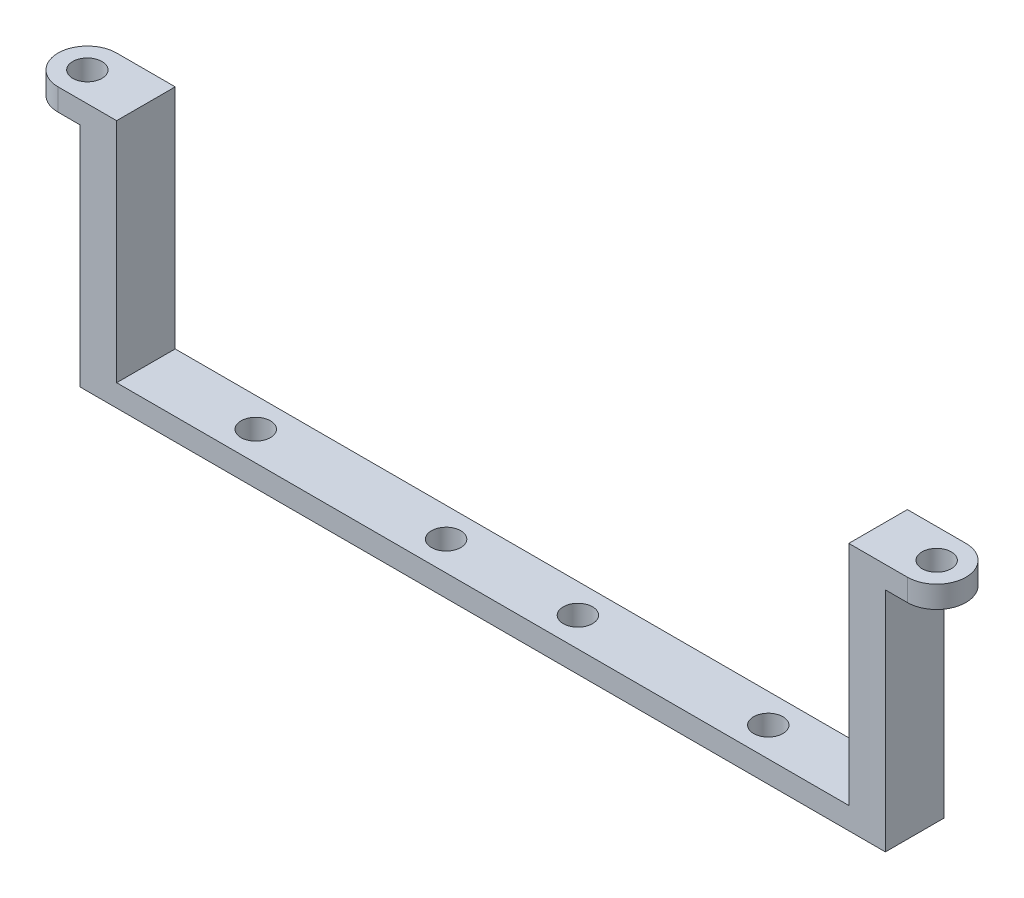
ISO-10303-21;
HEADER;
FILE_DESCRIPTION(('STEP AP214'),'2;1');
FILE_NAME('part.step','',(''),(''),'','','');
FILE_SCHEMA(('AUTOMOTIVE_DESIGN { 1 0 10303 214 1 1 1 1 }'));
ENDSEC;
DATA;
#1=APPLICATION_CONTEXT('core data for automotive mechanical design processes');
#2=APPLICATION_PROTOCOL_DEFINITION('international standard','automotive_design',2000,#1);
#3=PRODUCT_CONTEXT('',#1,'mechanical');
#4=PRODUCT('Part','Part','',(#3));
#5=PRODUCT_RELATED_PRODUCT_CATEGORY('part','',(#4));
#6=PRODUCT_DEFINITION_FORMATION('','',#4);
#7=PRODUCT_DEFINITION_CONTEXT('part definition',#1,'design');
#8=PRODUCT_DEFINITION('design','',#6,#7);
#9=PRODUCT_DEFINITION_SHAPE('','',#8);
#10=(LENGTH_UNIT() NAMED_UNIT(*) SI_UNIT(.MILLI.,.METRE.));
#11=(NAMED_UNIT(*) PLANE_ANGLE_UNIT() SI_UNIT($,.RADIAN.));
#12=(NAMED_UNIT(*) SI_UNIT($,.STERADIAN.) SOLID_ANGLE_UNIT());
#13=UNCERTAINTY_MEASURE_WITH_UNIT(LENGTH_MEASURE(1.E-05),#10,'distance_accuracy_value','');
#14=(GEOMETRIC_REPRESENTATION_CONTEXT(3) GLOBAL_UNCERTAINTY_ASSIGNED_CONTEXT((#13)) GLOBAL_UNIT_ASSIGNED_CONTEXT((#10,
#11,#12)) REPRESENTATION_CONTEXT('',''));
#15=CARTESIAN_POINT('',(0.,0.,0.));
#16=DIRECTION('',(0.,0.,1.));
#17=DIRECTION('',(1.,0.,0.));
#18=AXIS2_PLACEMENT_3D('',#15,#16,#17);
#19=CARTESIAN_POINT('',(0.,3.,0.));
#20=DIRECTION('',(0.,-1.,0.));
#21=DIRECTION('',(0.,0.,-1.));
#22=AXIS2_PLACEMENT_3D('',#19,#20,#21);
#23=PLANE('',#22);
#24=CARTESIAN_POINT('',(-35.,3.,0.));
#25=DIRECTION('',(0.,1.,0.));
#26=DIRECTION('',(0.,0.,1.));
#27=AXIS2_PLACEMENT_3D('',#24,#25,#26);
#28=CIRCLE('',#27,2.);
#29=CARTESIAN_POINT('',(-35.,3.,2.));
#30=VERTEX_POINT('',#29);
#31=EDGE_CURVE('E240',#30,#30,#28,.T.);
#32=ORIENTED_EDGE('',*,*,#31,.F.);
#33=EDGE_LOOP('',(#32));
#34=FACE_BOUND('',#33,.T.);
#35=CARTESIAN_POINT('',(35.,3.,0.));
#36=DIRECTION('',(0.,1.,0.));
#37=DIRECTION('',(0.,0.,1.));
#38=AXIS2_PLACEMENT_3D('',#35,#36,#37);
#39=CIRCLE('',#38,2.);
#40=CARTESIAN_POINT('',(35.,3.,2.));
#41=VERTEX_POINT('',#40);
#42=EDGE_CURVE('E234',#41,#41,#39,.T.);
#43=ORIENTED_EDGE('',*,*,#42,.F.);
#44=EDGE_LOOP('',(#43));
#45=FACE_BOUND('',#44,.T.);
#46=CARTESIAN_POINT('',(-8.99999999999999,3.,0.));
#47=DIRECTION('',(0.,1.,0.));
#48=DIRECTION('',(0.,0.,1.));
#49=AXIS2_PLACEMENT_3D('',#46,#47,#48);
#50=CIRCLE('',#49,2.);
#51=CARTESIAN_POINT('',(-8.99999999999999,3.,2.));
#52=VERTEX_POINT('',#51);
#53=EDGE_CURVE('E228',#52,#52,#50,.T.);
#54=ORIENTED_EDGE('',*,*,#53,.F.);
#55=EDGE_LOOP('',(#54));
#56=FACE_BOUND('',#55,.T.);
#57=CARTESIAN_POINT('',(9.00000000000001,3.,0.));
#58=DIRECTION('',(0.,1.,0.));
#59=DIRECTION('',(0.,0.,1.));
#60=AXIS2_PLACEMENT_3D('',#57,#58,#59);
#61=CIRCLE('',#60,2.);
#62=CARTESIAN_POINT('',(9.00000000000001,3.,2.));
#63=VERTEX_POINT('',#62);
#64=EDGE_CURVE('E222',#63,#63,#61,.T.);
#65=ORIENTED_EDGE('',*,*,#64,.F.);
#66=EDGE_LOOP('',(#65));
#67=FACE_BOUND('',#66,.T.);
#68=DIRECTION('',(0.,0.,1.));
#69=VECTOR('',#68,1.);
#70=CARTESIAN_POINT('',(50.,3.,-4.00000000000001));
#71=LINE('',#70,#69);
#72=CARTESIAN_POINT('',(50.,3.,-4.00000000000001));
#73=VERTEX_POINT('',#72);
#74=CARTESIAN_POINT('',(50.,3.,4.));
#75=VERTEX_POINT('',#74);
#76=EDGE_CURVE('E207',#73,#75,#71,.T.);
#77=ORIENTED_EDGE('',*,*,#76,.F.);
#78=DIRECTION('',(-1.,0.,0.));
#79=VECTOR('',#78,1.);
#80=CARTESIAN_POINT('',(55.,3.,-4.00000000000001));
#81=LINE('',#80,#79);
#82=CARTESIAN_POINT('',(-50.,3.,-4.00000000000001));
#83=VERTEX_POINT('',#82);
#84=EDGE_CURVE('E247',#73,#83,#81,.T.);
#85=ORIENTED_EDGE('',*,*,#84,.T.);
#86=DIRECTION('',(0.,0.,-1.));
#87=VECTOR('',#86,1.);
#88=CARTESIAN_POINT('',(-50.,3.,-4.00000000000001));
#89=LINE('',#88,#87);
#90=CARTESIAN_POINT('',(-50.,3.,4.00000000000001));
#91=VERTEX_POINT('',#90);
#92=EDGE_CURVE('E61',#91,#83,#89,.T.);
#93=ORIENTED_EDGE('',*,*,#92,.F.);
#94=DIRECTION('',(1.,0.,0.));
#95=VECTOR('',#94,1.);
#96=CARTESIAN_POINT('',(55.,3.,3.99999999999999));
#97=LINE('',#96,#95);
#98=EDGE_CURVE('E56',#91,#75,#97,.T.);
#99=ORIENTED_EDGE('',*,*,#98,.T.);
#100=EDGE_LOOP('',(#77,#85,#93,#99));
#101=FACE_BOUND('',#100,.T.);
#102=ADVANCED_FACE('F41',(#34,#45,#56,#67,#101),#23,.F.);
#103=CARTESIAN_POINT('',(0.,0.,0.));
#104=DIRECTION('',(0.,-1.,0.));
#105=DIRECTION('',(0.,0.,-1.));
#106=AXIS2_PLACEMENT_3D('',#103,#104,#105);
#107=PLANE('',#106);
#108=CARTESIAN_POINT('',(-8.99999999999999,0.,0.));
#109=DIRECTION('',(0.,1.,0.));
#110=DIRECTION('',(0.,0.,1.));
#111=AXIS2_PLACEMENT_3D('',#108,#109,#110);
#112=CIRCLE('',#111,2.);
#113=CARTESIAN_POINT('',(-8.99999999999999,0.,2.));
#114=VERTEX_POINT('',#113);
#115=EDGE_CURVE('E225',#114,#114,#112,.T.);
#116=ORIENTED_EDGE('',*,*,#115,.T.);
#117=EDGE_LOOP('',(#116));
#118=FACE_BOUND('',#117,.T.);
#119=CARTESIAN_POINT('',(-35.,0.,0.));
#120=DIRECTION('',(0.,1.,0.));
#121=DIRECTION('',(0.,0.,1.));
#122=AXIS2_PLACEMENT_3D('',#119,#120,#121);
#123=CIRCLE('',#122,2.);
#124=CARTESIAN_POINT('',(-35.,0.,2.));
#125=VERTEX_POINT('',#124);
#126=EDGE_CURVE('E237',#125,#125,#123,.T.);
#127=ORIENTED_EDGE('',*,*,#126,.T.);
#128=EDGE_LOOP('',(#127));
#129=FACE_BOUND('',#128,.T.);
#130=DIRECTION('',(0.,0.,1.));
#131=VECTOR('',#130,1.);
#132=CARTESIAN_POINT('',(-55.,0.,-3.99999999999999));
#133=LINE('',#132,#131);
#134=CARTESIAN_POINT('',(-55.,0.,-3.99999999999999));
#135=VERTEX_POINT('',#134);
#136=CARTESIAN_POINT('',(-55.,0.,4.00000000000001));
#137=VERTEX_POINT('',#136);
#138=EDGE_CURVE('E243',#135,#137,#133,.T.);
#139=ORIENTED_EDGE('',*,*,#138,.F.);
#140=DIRECTION('',(-1.,0.,0.));
#141=VECTOR('',#140,1.);
#142=CARTESIAN_POINT('',(55.,0.,-4.00000000000001));
#143=LINE('',#142,#141);
#144=CARTESIAN_POINT('',(55.,0.,-4.00000000000001));
#145=VERTEX_POINT('',#144);
#146=EDGE_CURVE('E248',#145,#135,#143,.T.);
#147=ORIENTED_EDGE('',*,*,#146,.F.);
#148=DIRECTION('',(0.,0.,-1.));
#149=VECTOR('',#148,1.);
#150=CARTESIAN_POINT('',(55.,0.,-4.00000000000001));
#151=LINE('',#150,#149);
#152=CARTESIAN_POINT('',(55.,0.,3.99999999999999));
#153=VERTEX_POINT('',#152);
#154=EDGE_CURVE('E255',#153,#145,#151,.T.);
#155=ORIENTED_EDGE('',*,*,#154,.F.);
#156=DIRECTION('',(1.,0.,0.));
#157=VECTOR('',#156,1.);
#158=CARTESIAN_POINT('',(55.,0.,3.99999999999999));
#159=LINE('',#158,#157);
#160=EDGE_CURVE('E253',#137,#153,#159,.T.);
#161=ORIENTED_EDGE('',*,*,#160,.F.);
#162=EDGE_LOOP('',(#139,#147,#155,#161));
#163=FACE_BOUND('',#162,.T.);
#164=CARTESIAN_POINT('',(35.,0.,0.));
#165=DIRECTION('',(0.,1.,0.));
#166=DIRECTION('',(0.,0.,1.));
#167=AXIS2_PLACEMENT_3D('',#164,#165,#166);
#168=CIRCLE('',#167,2.);
#169=CARTESIAN_POINT('',(35.,0.,2.));
#170=VERTEX_POINT('',#169);
#171=EDGE_CURVE('E231',#170,#170,#168,.T.);
#172=ORIENTED_EDGE('',*,*,#171,.T.);
#173=EDGE_LOOP('',(#172));
#174=FACE_BOUND('',#173,.T.);
#175=CARTESIAN_POINT('',(9.00000000000001,0.,0.));
#176=DIRECTION('',(0.,1.,0.));
#177=DIRECTION('',(0.,0.,1.));
#178=AXIS2_PLACEMENT_3D('',#175,#176,#177);
#179=CIRCLE('',#178,2.);
#180=CARTESIAN_POINT('',(9.00000000000001,0.,2.));
#181=VERTEX_POINT('',#180);
#182=EDGE_CURVE('E221',#181,#181,#179,.T.);
#183=ORIENTED_EDGE('',*,*,#182,.T.);
#184=EDGE_LOOP('',(#183));
#185=FACE_BOUND('',#184,.T.);
#186=ADVANCED_FACE('F269',(#118,#129,#163,#174,#185),#107,.T.);
#187=CARTESIAN_POINT('',(-55.,3.,-3.99999999999999));
#188=DIRECTION('',(1.,0.,0.));
#189=DIRECTION('',(0.,0.,-1.));
#190=AXIS2_PLACEMENT_3D('',#187,#188,#189);
#191=PLANE('',#190);
#192=ORIENTED_EDGE('',*,*,#138,.T.);
#193=DIRECTION('',(0.,-1.,0.));
#194=VECTOR('',#193,1.);
#195=CARTESIAN_POINT('',(-55.,3.,4.00000000000001));
#196=LINE('',#195,#194);
#197=CARTESIAN_POINT('',(-55.,31.,4.00000000000001));
#198=VERTEX_POINT('',#197);
#199=EDGE_CURVE('E11',#198,#137,#196,.T.);
#200=ORIENTED_EDGE('',*,*,#199,.F.);
#201=DIRECTION('',(0.,0.,1.));
#202=VECTOR('',#201,1.);
#203=CARTESIAN_POINT('',(-55.,31.,-3.99999999999999));
#204=LINE('',#203,#202);
#205=CARTESIAN_POINT('',(-55.,31.,-3.99999999999999));
#206=VERTEX_POINT('',#205);
#207=EDGE_CURVE('E211',#206,#198,#204,.T.);
#208=ORIENTED_EDGE('',*,*,#207,.F.);
#209=DIRECTION('',(0.,-1.,0.));
#210=VECTOR('',#209,1.);
#211=CARTESIAN_POINT('',(-55.,3.,-3.99999999999999));
#212=LINE('',#211,#210);
#213=EDGE_CURVE('E250',#206,#135,#212,.T.);
#214=ORIENTED_EDGE('',*,*,#213,.T.);
#215=EDGE_LOOP('',(#192,#200,#208,#214));
#216=FACE_BOUND('',#215,.T.);
#217=ADVANCED_FACE('F43',(#216),#191,.F.);
#218=CARTESIAN_POINT('',(55.,3.,3.99999999999999));
#219=DIRECTION('',(0.,0.,-1.));
#220=DIRECTION('',(-1.,0.,0.));
#221=AXIS2_PLACEMENT_3D('',#218,#219,#220);
#222=PLANE('',#221);
#223=ORIENTED_EDGE('',*,*,#160,.T.);
#224=DIRECTION('',(0.,-1.,0.));
#225=VECTOR('',#224,1.);
#226=CARTESIAN_POINT('',(55.,3.,3.99999999999999));
#227=LINE('',#226,#225);
#228=CARTESIAN_POINT('',(55.,31.,3.99999999999999));
#229=VERTEX_POINT('',#228);
#230=EDGE_CURVE('E49',#229,#153,#227,.T.);
#231=ORIENTED_EDGE('',*,*,#230,.F.);
#232=DIRECTION('',(1.,0.,0.));
#233=VECTOR('',#232,1.);
#234=CARTESIAN_POINT('',(50.,31.,4.00000000000001));
#235=LINE('',#234,#233);
#236=CARTESIAN_POINT('',(58.,31.,4.00000000000005));
#237=VERTEX_POINT('',#236);
#238=EDGE_CURVE('E141',#229,#237,#235,.T.);
#239=ORIENTED_EDGE('',*,*,#238,.T.);
#240=DIRECTION('',(0.,-1.,0.));
#241=VECTOR('',#240,1.);
#242=CARTESIAN_POINT('',(58.,34.,4.00000000000005));
#243=LINE('',#242,#241);
#244=CARTESIAN_POINT('',(58.,34.,4.00000000000005));
#245=VERTEX_POINT('',#244);
#246=EDGE_CURVE('E137',#245,#237,#243,.T.);
#247=ORIENTED_EDGE('',*,*,#246,.F.);
#248=DIRECTION('',(1.,0.,0.));
#249=VECTOR('',#248,1.);
#250=CARTESIAN_POINT('',(50.,34.,4.00000000000001));
#251=LINE('',#250,#249);
#252=CARTESIAN_POINT('',(50.,34.,4.00000000000001));
#253=VERTEX_POINT('',#252);
#254=EDGE_CURVE('E158',#253,#245,#251,.T.);
#255=ORIENTED_EDGE('',*,*,#254,.F.);
#256=DIRECTION('',(0.,-1.,0.));
#257=VECTOR('',#256,1.);
#258=CARTESIAN_POINT('',(50.,31.,4.00000000000001));
#259=LINE('',#258,#257);
#260=EDGE_CURVE('E202',#253,#75,#259,.T.);
#261=ORIENTED_EDGE('',*,*,#260,.T.);
#262=ORIENTED_EDGE('',*,*,#98,.F.);
#263=DIRECTION('',(0.,-1.,0.));
#264=VECTOR('',#263,1.);
#265=CARTESIAN_POINT('',(-50.,31.,4.00000000000001));
#266=LINE('',#265,#264);
#267=CARTESIAN_POINT('',(-50.,34.,4.00000000000001));
#268=VERTEX_POINT('',#267);
#269=EDGE_CURVE('E218',#268,#91,#266,.T.);
#270=ORIENTED_EDGE('',*,*,#269,.F.);
#271=DIRECTION('',(1.,0.,0.));
#272=VECTOR('',#271,1.);
#273=CARTESIAN_POINT('',(-50.,34.,4.00000000000001));
#274=LINE('',#273,#272);
#275=CARTESIAN_POINT('',(-58.,34.,4.00000000000001));
#276=VERTEX_POINT('',#275);
#277=EDGE_CURVE('E188',#276,#268,#274,.T.);
#278=ORIENTED_EDGE('',*,*,#277,.F.);
#279=DIRECTION('',(0.,-1.,0.));
#280=VECTOR('',#279,1.);
#281=CARTESIAN_POINT('',(-58.,34.,4.00000000000001));
#282=LINE('',#281,#280);
#283=CARTESIAN_POINT('',(-58.,31.,4.00000000000001));
#284=VERTEX_POINT('',#283);
#285=EDGE_CURVE('E191',#276,#284,#282,.T.);
#286=ORIENTED_EDGE('',*,*,#285,.T.);
#287=DIRECTION('',(1.,0.,0.));
#288=VECTOR('',#287,1.);
#289=CARTESIAN_POINT('',(-50.,31.,4.00000000000001));
#290=LINE('',#289,#288);
#291=EDGE_CURVE('E184',#284,#198,#290,.T.);
#292=ORIENTED_EDGE('',*,*,#291,.T.);
#293=ORIENTED_EDGE('',*,*,#199,.T.);
#294=EDGE_LOOP('',(#223,#231,#239,#247,#255,#261,#262,#270,#278,#286,#292,#293));
#295=FACE_BOUND('',#294,.T.);
#296=ADVANCED_FACE('F291',(#295),#222,.F.);
#297=CARTESIAN_POINT('',(55.,3.,-4.00000000000001));
#298=DIRECTION('',(-1.,0.,0.));
#299=DIRECTION('',(0.,0.,1.));
#300=AXIS2_PLACEMENT_3D('',#297,#298,#299);
#301=PLANE('',#300);
#302=ORIENTED_EDGE('',*,*,#154,.T.);
#303=DIRECTION('',(0.,-1.,0.));
#304=VECTOR('',#303,1.);
#305=CARTESIAN_POINT('',(55.,3.,-4.00000000000001));
#306=LINE('',#305,#304);
#307=CARTESIAN_POINT('',(55.,31.,-4.00000000000001));
#308=VERTEX_POINT('',#307);
#309=EDGE_CURVE('E260',#308,#145,#306,.T.);
#310=ORIENTED_EDGE('',*,*,#309,.F.);
#311=DIRECTION('',(0.,0.,-1.));
#312=VECTOR('',#311,1.);
#313=CARTESIAN_POINT('',(55.,31.,-4.00000000000001));
#314=LINE('',#313,#312);
#315=EDGE_CURVE('E154',#229,#308,#314,.T.);
#316=ORIENTED_EDGE('',*,*,#315,.F.);
#317=ORIENTED_EDGE('',*,*,#230,.T.);
#318=EDGE_LOOP('',(#302,#310,#316,#317));
#319=FACE_BOUND('',#318,.T.);
#320=ADVANCED_FACE('F264',(#319),#301,.F.);
#321=CARTESIAN_POINT('',(55.,3.,-4.00000000000001));
#322=DIRECTION('',(0.,0.,1.));
#323=DIRECTION('',(1.,0.,0.));
#324=AXIS2_PLACEMENT_3D('',#321,#322,#323);
#325=PLANE('',#324);
#326=ORIENTED_EDGE('',*,*,#146,.T.);
#327=ORIENTED_EDGE('',*,*,#213,.F.);
#328=DIRECTION('',(-1.,0.,0.));
#329=VECTOR('',#328,1.);
#330=CARTESIAN_POINT('',(-50.,31.,-4.00000000000001));
#331=LINE('',#330,#329);
#332=CARTESIAN_POINT('',(-58.,31.,-4.));
#333=VERTEX_POINT('',#332);
#334=EDGE_CURVE('E177',#206,#333,#331,.T.);
#335=ORIENTED_EDGE('',*,*,#334,.T.);
#336=DIRECTION('',(0.,-1.,0.));
#337=VECTOR('',#336,1.);
#338=CARTESIAN_POINT('',(-58.,34.,-4.));
#339=LINE('',#338,#337);
#340=CARTESIAN_POINT('',(-58.,34.,-4.));
#341=VERTEX_POINT('',#340);
#342=EDGE_CURVE('E199',#341,#333,#339,.T.);
#343=ORIENTED_EDGE('',*,*,#342,.F.);
#344=DIRECTION('',(-1.,0.,0.));
#345=VECTOR('',#344,1.);
#346=CARTESIAN_POINT('',(-50.,34.,-4.00000000000001));
#347=LINE('',#346,#345);
#348=CARTESIAN_POINT('',(-50.,34.,-4.00000000000001));
#349=VERTEX_POINT('',#348);
#350=EDGE_CURVE('E183',#349,#341,#347,.T.);
#351=ORIENTED_EDGE('',*,*,#350,.F.);
#352=DIRECTION('',(0.,-1.,0.));
#353=VECTOR('',#352,1.);
#354=CARTESIAN_POINT('',(-50.,31.,-4.00000000000001));
#355=LINE('',#354,#353);
#356=EDGE_CURVE('E214',#349,#83,#355,.T.);
#357=ORIENTED_EDGE('',*,*,#356,.T.);
#358=ORIENTED_EDGE('',*,*,#84,.F.);
#359=DIRECTION('',(0.,-1.,0.));
#360=VECTOR('',#359,1.);
#361=CARTESIAN_POINT('',(50.,31.,-4.00000000000001));
#362=LINE('',#361,#360);
#363=CARTESIAN_POINT('',(50.,34.,-4.00000000000001));
#364=VERTEX_POINT('',#363);
#365=EDGE_CURVE('E204',#364,#73,#362,.T.);
#366=ORIENTED_EDGE('',*,*,#365,.F.);
#367=DIRECTION('',(-1.,0.,0.));
#368=VECTOR('',#367,1.);
#369=CARTESIAN_POINT('',(50.,34.,-4.00000000000001));
#370=LINE('',#369,#368);
#371=CARTESIAN_POINT('',(58.,34.,-4.00000000000008));
#372=VERTEX_POINT('',#371);
#373=EDGE_CURVE('E149',#372,#364,#370,.T.);
#374=ORIENTED_EDGE('',*,*,#373,.F.);
#375=DIRECTION('',(0.,-1.,0.));
#376=VECTOR('',#375,1.);
#377=CARTESIAN_POINT('',(58.,34.,-4.00000000000008));
#378=LINE('',#377,#376);
#379=CARTESIAN_POINT('',(58.,31.,-4.00000000000008));
#380=VERTEX_POINT('',#379);
#381=EDGE_CURVE('E134',#372,#380,#378,.T.);
#382=ORIENTED_EDGE('',*,*,#381,.T.);
#383=DIRECTION('',(-1.,0.,0.));
#384=VECTOR('',#383,1.);
#385=CARTESIAN_POINT('',(50.,31.,-4.00000000000001));
#386=LINE('',#385,#384);
#387=EDGE_CURVE('E142',#380,#308,#386,.T.);
#388=ORIENTED_EDGE('',*,*,#387,.T.);
#389=ORIENTED_EDGE('',*,*,#309,.T.);
#390=EDGE_LOOP('',(#326,#327,#335,#343,#351,#357,#358,#366,#374,#382,#388,#389));
#391=FACE_BOUND('',#390,.T.);
#392=ADVANCED_FACE('F146',(#391),#325,.F.);
#393=CARTESIAN_POINT('',(-35.,3.,0.));
#394=DIRECTION('',(0.,-1.,0.));
#395=DIRECTION('',(0.,0.,-1.));
#396=AXIS2_PLACEMENT_3D('',#393,#394,#395);
#397=CYLINDRICAL_SURFACE('',#396,2.);
#398=ORIENTED_EDGE('',*,*,#31,.T.);
#399=EDGE_LOOP('',(#398));
#400=FACE_BOUND('',#399,.T.);
#401=ORIENTED_EDGE('',*,*,#126,.F.);
#402=EDGE_LOOP('',(#401));
#403=FACE_BOUND('',#402,.T.);
#404=ADVANCED_FACE('F307',(#400,#403),#397,.F.);
#405=CARTESIAN_POINT('',(35.,3.,0.));
#406=DIRECTION('',(0.,-1.,0.));
#407=DIRECTION('',(0.,0.,-1.));
#408=AXIS2_PLACEMENT_3D('',#405,#406,#407);
#409=CYLINDRICAL_SURFACE('',#408,2.);
#410=ORIENTED_EDGE('',*,*,#42,.T.);
#411=EDGE_LOOP('',(#410));
#412=FACE_BOUND('',#411,.T.);
#413=ORIENTED_EDGE('',*,*,#171,.F.);
#414=EDGE_LOOP('',(#413));
#415=FACE_BOUND('',#414,.T.);
#416=ADVANCED_FACE('F334',(#412,#415),#409,.F.);
#417=CARTESIAN_POINT('',(-8.99999999999999,3.,0.));
#418=DIRECTION('',(0.,-1.,0.));
#419=DIRECTION('',(0.,0.,-1.));
#420=AXIS2_PLACEMENT_3D('',#417,#418,#419);
#421=CYLINDRICAL_SURFACE('',#420,2.);
#422=ORIENTED_EDGE('',*,*,#53,.T.);
#423=EDGE_LOOP('',(#422));
#424=FACE_BOUND('',#423,.T.);
#425=ORIENTED_EDGE('',*,*,#115,.F.);
#426=EDGE_LOOP('',(#425));
#427=FACE_BOUND('',#426,.T.);
#428=ADVANCED_FACE('F345',(#424,#427),#421,.F.);
#429=CARTESIAN_POINT('',(9.00000000000001,3.,0.));
#430=DIRECTION('',(0.,-1.,0.));
#431=DIRECTION('',(0.,0.,-1.));
#432=AXIS2_PLACEMENT_3D('',#429,#430,#431);
#433=CYLINDRICAL_SURFACE('',#432,2.);
#434=ORIENTED_EDGE('',*,*,#64,.T.);
#435=EDGE_LOOP('',(#434));
#436=FACE_BOUND('',#435,.T.);
#437=ORIENTED_EDGE('',*,*,#182,.F.);
#438=EDGE_LOOP('',(#437));
#439=FACE_BOUND('',#438,.T.);
#440=ADVANCED_FACE('F355',(#436,#439),#433,.F.);
#441=CARTESIAN_POINT('',(-50.,31.,-4.00000000000001));
#442=DIRECTION('',(-1.,0.,0.));
#443=DIRECTION('',(0.,0.,1.));
#444=AXIS2_PLACEMENT_3D('',#441,#442,#443);
#445=PLANE('',#444);
#446=ORIENTED_EDGE('',*,*,#92,.T.);
#447=ORIENTED_EDGE('',*,*,#356,.F.);
#448=DIRECTION('',(0.,0.,-1.));
#449=VECTOR('',#448,1.);
#450=CARTESIAN_POINT('',(-50.,34.,-4.00000000000001));
#451=LINE('',#450,#449);
#452=EDGE_CURVE('E180',#268,#349,#451,.T.);
#453=ORIENTED_EDGE('',*,*,#452,.F.);
#454=ORIENTED_EDGE('',*,*,#269,.T.);
#455=EDGE_LOOP('',(#446,#447,#453,#454));
#456=FACE_BOUND('',#455,.T.);
#457=ADVANCED_FACE('F290',(#456),#445,.F.);
#458=CARTESIAN_POINT('',(50.,31.,-4.00000000000001));
#459=DIRECTION('',(1.,0.,0.));
#460=DIRECTION('',(0.,0.,-1.));
#461=AXIS2_PLACEMENT_3D('',#458,#459,#460);
#462=PLANE('',#461);
#463=ORIENTED_EDGE('',*,*,#76,.T.);
#464=ORIENTED_EDGE('',*,*,#260,.F.);
#465=DIRECTION('',(0.,0.,1.));
#466=VECTOR('',#465,1.);
#467=CARTESIAN_POINT('',(50.,34.,-4.00000000000001));
#468=LINE('',#467,#466);
#469=EDGE_CURVE('E155',#364,#253,#468,.T.);
#470=ORIENTED_EDGE('',*,*,#469,.F.);
#471=ORIENTED_EDGE('',*,*,#365,.T.);
#472=EDGE_LOOP('',(#463,#464,#470,#471));
#473=FACE_BOUND('',#472,.T.);
#474=ADVANCED_FACE('F295',(#473),#462,.F.);
#475=CARTESIAN_POINT('',(-58.,31.,0.));
#476=DIRECTION('',(0.,1.,0.));
#477=DIRECTION('',(0.,0.,1.));
#478=AXIS2_PLACEMENT_3D('',#475,#476,#477);
#479=PLANE('',#478);
#480=CARTESIAN_POINT('',(-58.,31.,0.));
#481=DIRECTION('',(0.,1.,0.));
#482=DIRECTION('',(0.,0.,1.));
#483=AXIS2_PLACEMENT_3D('',#480,#481,#482);
#484=CIRCLE('',#483,2.);
#485=CARTESIAN_POINT('',(-58.,31.,2.00000000000001));
#486=VERTEX_POINT('',#485);
#487=EDGE_CURVE('E171',#486,#486,#484,.T.);
#488=ORIENTED_EDGE('',*,*,#487,.T.);
#489=EDGE_LOOP('',(#488));
#490=FACE_BOUND('',#489,.T.);
#491=ORIENTED_EDGE('',*,*,#334,.F.);
#492=ORIENTED_EDGE('',*,*,#207,.T.);
#493=ORIENTED_EDGE('',*,*,#291,.F.);
#494=CARTESIAN_POINT('',(-58.,31.,0.));
#495=DIRECTION('',(0.,1.,0.));
#496=DIRECTION('',(0.,0.,1.));
#497=AXIS2_PLACEMENT_3D('',#494,#495,#496);
#498=CIRCLE('',#497,4.00000000000001);
#499=EDGE_CURVE('E193',#333,#284,#498,.T.);
#500=ORIENTED_EDGE('',*,*,#499,.F.);
#501=EDGE_LOOP('',(#491,#492,#493,#500));
#502=FACE_BOUND('',#501,.T.);
#503=ADVANCED_FACE('F277',(#490,#502),#479,.F.);
#504=CARTESIAN_POINT('',(-58.,34.,0.));
#505=DIRECTION('',(0.,1.,0.));
#506=DIRECTION('',(0.,0.,1.));
#507=AXIS2_PLACEMENT_3D('',#504,#505,#506);
#508=PLANE('',#507);
#509=ORIENTED_EDGE('',*,*,#452,.T.);
#510=ORIENTED_EDGE('',*,*,#350,.T.);
#511=CARTESIAN_POINT('',(-58.,34.,0.));
#512=DIRECTION('',(0.,1.,0.));
#513=DIRECTION('',(0.,0.,1.));
#514=AXIS2_PLACEMENT_3D('',#511,#512,#513);
#515=CIRCLE('',#514,4.00000000000001);
#516=EDGE_CURVE('E186',#341,#276,#515,.T.);
#517=ORIENTED_EDGE('',*,*,#516,.T.);
#518=ORIENTED_EDGE('',*,*,#277,.T.);
#519=EDGE_LOOP('',(#509,#510,#517,#518));
#520=FACE_BOUND('',#519,.T.);
#521=CARTESIAN_POINT('',(-58.,34.,0.));
#522=DIRECTION('',(0.,1.,0.));
#523=DIRECTION('',(0.,0.,1.));
#524=AXIS2_PLACEMENT_3D('',#521,#522,#523);
#525=CIRCLE('',#524,2.);
#526=CARTESIAN_POINT('',(-58.,34.,2.00000000000001));
#527=VERTEX_POINT('',#526);
#528=EDGE_CURVE('E174',#527,#527,#525,.T.);
#529=ORIENTED_EDGE('',*,*,#528,.F.);
#530=EDGE_LOOP('',(#529));
#531=FACE_BOUND('',#530,.T.);
#532=ADVANCED_FACE('F286',(#520,#531),#508,.T.);
#533=CARTESIAN_POINT('',(-58.,34.,0.));
#534=DIRECTION('',(0.,-1.,0.));
#535=DIRECTION('',(0.,0.,-1.));
#536=AXIS2_PLACEMENT_3D('',#533,#534,#535);
#537=CYLINDRICAL_SURFACE('',#536,4.00000000000001);
#538=ORIENTED_EDGE('',*,*,#499,.T.);
#539=ORIENTED_EDGE('',*,*,#285,.F.);
#540=ORIENTED_EDGE('',*,*,#516,.F.);
#541=ORIENTED_EDGE('',*,*,#342,.T.);
#542=EDGE_LOOP('',(#538,#539,#540,#541));
#543=FACE_BOUND('',#542,.T.);
#544=ADVANCED_FACE('F282',(#543),#537,.T.);
#545=CARTESIAN_POINT('',(-58.,34.,0.));
#546=DIRECTION('',(0.,-1.,0.));
#547=DIRECTION('',(0.,0.,-1.));
#548=AXIS2_PLACEMENT_3D('',#545,#546,#547);
#549=CYLINDRICAL_SURFACE('',#548,2.);
#550=ORIENTED_EDGE('',*,*,#528,.T.);
#551=EDGE_LOOP('',(#550));
#552=FACE_BOUND('',#551,.T.);
#553=ORIENTED_EDGE('',*,*,#487,.F.);
#554=EDGE_LOOP('',(#553));
#555=FACE_BOUND('',#554,.T.);
#556=ADVANCED_FACE('F468',(#552,#555),#549,.F.);
#557=CARTESIAN_POINT('',(58.,31.,0.));
#558=DIRECTION('',(0.,-1.,0.));
#559=DIRECTION('',(0.,0.,-1.));
#560=AXIS2_PLACEMENT_3D('',#557,#558,#559);
#561=PLANE('',#560);
#562=CARTESIAN_POINT('',(58.,31.,0.));
#563=DIRECTION('',(0.,1.,0.));
#564=DIRECTION('',(0.,0.,-1.));
#565=AXIS2_PLACEMENT_3D('',#562,#563,#564);
#566=CIRCLE('',#565,2.);
#567=CARTESIAN_POINT('',(58.,31.,-2.));
#568=VERTEX_POINT('',#567);
#569=EDGE_CURVE('E168',#568,#568,#566,.T.);
#570=ORIENTED_EDGE('',*,*,#569,.T.);
#571=EDGE_LOOP('',(#570));
#572=FACE_BOUND('',#571,.T.);
#573=ORIENTED_EDGE('',*,*,#315,.T.);
#574=ORIENTED_EDGE('',*,*,#387,.F.);
#575=CARTESIAN_POINT('',(58.,31.,0.));
#576=DIRECTION('',(0.,1.,0.));
#577=DIRECTION('',(0.,0.,-1.));
#578=AXIS2_PLACEMENT_3D('',#575,#576,#577);
#579=CIRCLE('',#578,4.00000000000004);
#580=EDGE_CURVE('E130',#237,#380,#579,.T.);
#581=ORIENTED_EDGE('',*,*,#580,.F.);
#582=ORIENTED_EDGE('',*,*,#238,.F.);
#583=EDGE_LOOP('',(#573,#574,#581,#582));
#584=FACE_BOUND('',#583,.T.);
#585=ADVANCED_FACE('F152',(#572,#584),#561,.T.);
#586=CARTESIAN_POINT('',(58.,34.,0.));
#587=DIRECTION('',(0.,-1.,0.));
#588=DIRECTION('',(0.,0.,-1.));
#589=AXIS2_PLACEMENT_3D('',#586,#587,#588);
#590=PLANE('',#589);
#591=ORIENTED_EDGE('',*,*,#469,.T.);
#592=ORIENTED_EDGE('',*,*,#254,.T.);
#593=CARTESIAN_POINT('',(58.,34.,0.));
#594=DIRECTION('',(0.,1.,0.));
#595=DIRECTION('',(0.,0.,-1.));
#596=AXIS2_PLACEMENT_3D('',#593,#594,#595);
#597=CIRCLE('',#596,4.00000000000004);
#598=EDGE_CURVE('E165',#245,#372,#597,.T.);
#599=ORIENTED_EDGE('',*,*,#598,.T.);
#600=ORIENTED_EDGE('',*,*,#373,.T.);
#601=EDGE_LOOP('',(#591,#592,#599,#600));
#602=FACE_BOUND('',#601,.T.);
#603=CARTESIAN_POINT('',(58.,34.,0.));
#604=DIRECTION('',(0.,1.,0.));
#605=DIRECTION('',(0.,0.,-1.));
#606=AXIS2_PLACEMENT_3D('',#603,#604,#605);
#607=CIRCLE('',#606,2.);
#608=CARTESIAN_POINT('',(58.,34.,-2.));
#609=VERTEX_POINT('',#608);
#610=EDGE_CURVE('E163',#609,#609,#607,.T.);
#611=ORIENTED_EDGE('',*,*,#610,.F.);
#612=EDGE_LOOP('',(#611));
#613=FACE_BOUND('',#612,.T.);
#614=ADVANCED_FACE('F488',(#602,#613),#590,.F.);
#615=CARTESIAN_POINT('',(58.,34.,0.));
#616=DIRECTION('',(0.,-1.,0.));
#617=DIRECTION('',(0.,0.,-1.));
#618=AXIS2_PLACEMENT_3D('',#615,#616,#617);
#619=CYLINDRICAL_SURFACE('',#618,4.00000000000004);
#620=ORIENTED_EDGE('',*,*,#580,.T.);
#621=ORIENTED_EDGE('',*,*,#381,.F.);
#622=ORIENTED_EDGE('',*,*,#598,.F.);
#623=ORIENTED_EDGE('',*,*,#246,.T.);
#624=EDGE_LOOP('',(#620,#621,#622,#623));
#625=FACE_BOUND('',#624,.T.);
#626=ADVANCED_FACE('F132',(#625),#619,.T.);
#627=CARTESIAN_POINT('',(58.,34.,0.));
#628=DIRECTION('',(0.,-1.,0.));
#629=DIRECTION('',(0.,0.,-1.));
#630=AXIS2_PLACEMENT_3D('',#627,#628,#629);
#631=CYLINDRICAL_SURFACE('',#630,2.);
#632=ORIENTED_EDGE('',*,*,#610,.T.);
#633=EDGE_LOOP('',(#632));
#634=FACE_BOUND('',#633,.T.);
#635=ORIENTED_EDGE('',*,*,#569,.F.);
#636=EDGE_LOOP('',(#635));
#637=FACE_BOUND('',#636,.T.);
#638=ADVANCED_FACE('F509',(#634,#637),#631,.F.);
#639=CLOSED_SHELL('',(#102,#186,#217,#296,#320,#392,#404,#416,#428,#440,#457,#474,#503,#532,
#544,#556,#585,#614,#626,#638));
#640=MANIFOLD_SOLID_BREP('B2',#639);
#641=ADVANCED_BREP_SHAPE_REPRESENTATION('',(#18,#640),#14);
#642=SHAPE_DEFINITION_REPRESENTATION(#9,#641);
ENDSEC;
END-ISO-10303-21;
